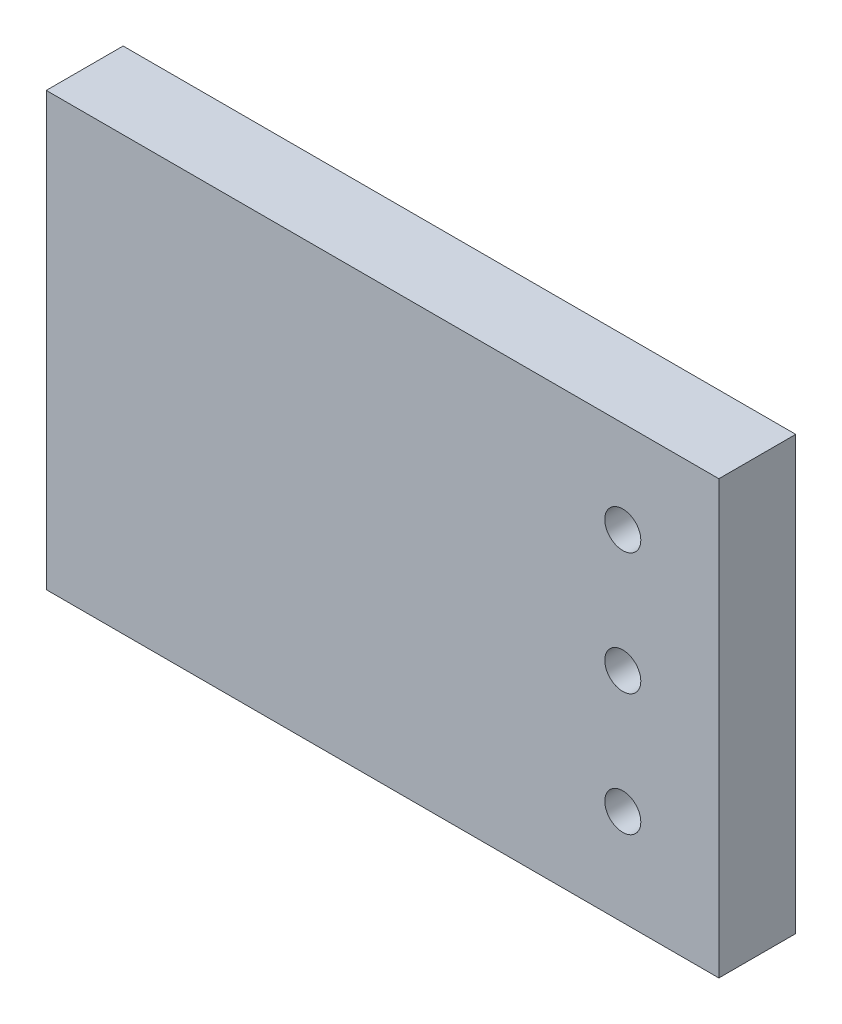
ISO-10303-21;
HEADER;
FILE_DESCRIPTION(('STEP AP214'),'2;1');
FILE_NAME('part.step','',(''),(''),'','','');
FILE_SCHEMA(('AUTOMOTIVE_DESIGN { 1 0 10303 214 1 1 1 1 }'));
ENDSEC;
DATA;
#1=APPLICATION_CONTEXT('core data for automotive mechanical design processes');
#2=APPLICATION_PROTOCOL_DEFINITION('international standard','automotive_design',2000,#1);
#3=PRODUCT_CONTEXT('',#1,'mechanical');
#4=PRODUCT('Part','Part','',(#3));
#5=PRODUCT_RELATED_PRODUCT_CATEGORY('part','',(#4));
#6=PRODUCT_DEFINITION_FORMATION('','',#4);
#7=PRODUCT_DEFINITION_CONTEXT('part definition',#1,'design');
#8=PRODUCT_DEFINITION('design','',#6,#7);
#9=PRODUCT_DEFINITION_SHAPE('','',#8);
#10=(LENGTH_UNIT() NAMED_UNIT(*) SI_UNIT(.MILLI.,.METRE.));
#11=(NAMED_UNIT(*) PLANE_ANGLE_UNIT() SI_UNIT($,.RADIAN.));
#12=(NAMED_UNIT(*) SI_UNIT($,.STERADIAN.) SOLID_ANGLE_UNIT());
#13=UNCERTAINTY_MEASURE_WITH_UNIT(LENGTH_MEASURE(1.E-05),#10,'distance_accuracy_value','');
#14=(GEOMETRIC_REPRESENTATION_CONTEXT(3) GLOBAL_UNCERTAINTY_ASSIGNED_CONTEXT((#13)) GLOBAL_UNIT_ASSIGNED_CONTEXT((#10,
#11,#12)) REPRESENTATION_CONTEXT('',''));
#15=CARTESIAN_POINT('',(0.,0.,0.));
#16=DIRECTION('',(0.,0.,1.));
#17=DIRECTION('',(1.,0.,0.));
#18=AXIS2_PLACEMENT_3D('',#15,#16,#17);
#19=CARTESIAN_POINT('',(0.,0.,1.6));
#20=DIRECTION('',(1.,0.,0.));
#21=DIRECTION('',(0.,1.,0.));
#22=AXIS2_PLACEMENT_3D('',#19,#20,#21);
#23=PLANE('',#22);
#24=DIRECTION('',(0.,-1.,0.));
#25=VECTOR('',#24,1.);
#26=CARTESIAN_POINT('',(0.,0.,0.));
#27=LINE('',#26,#25);
#28=CARTESIAN_POINT('',(0.,0.,0.));
#29=VERTEX_POINT('',#28);
#30=CARTESIAN_POINT('',(0.,-9.,0.));
#31=VERTEX_POINT('',#30);
#32=EDGE_CURVE('E97',#29,#31,#27,.T.);
#33=ORIENTED_EDGE('',*,*,#32,.T.);
#34=DIRECTION('',(0.,0.,-1.));
#35=VECTOR('',#34,1.);
#36=CARTESIAN_POINT('',(0.,-9.,1.6));
#37=LINE('',#36,#35);
#38=CARTESIAN_POINT('',(0.,-9.,1.6));
#39=VERTEX_POINT('',#38);
#40=EDGE_CURVE('E11',#39,#31,#37,.T.);
#41=ORIENTED_EDGE('',*,*,#40,.F.);
#42=DIRECTION('',(0.,-1.,0.));
#43=VECTOR('',#42,1.);
#44=CARTESIAN_POINT('',(0.,0.,1.6));
#45=LINE('',#44,#43);
#46=CARTESIAN_POINT('',(0.,0.,1.6));
#47=VERTEX_POINT('',#46);
#48=EDGE_CURVE('E85',#47,#39,#45,.T.);
#49=ORIENTED_EDGE('',*,*,#48,.F.);
#50=DIRECTION('',(0.,0.,-1.));
#51=VECTOR('',#50,1.);
#52=CARTESIAN_POINT('',(0.,0.,1.6));
#53=LINE('',#52,#51);
#54=EDGE_CURVE('E93',#47,#29,#53,.T.);
#55=ORIENTED_EDGE('',*,*,#54,.T.);
#56=EDGE_LOOP('',(#33,#41,#49,#55));
#57=FACE_BOUND('',#56,.T.);
#58=ADVANCED_FACE('F34',(#57),#23,.F.);
#59=CARTESIAN_POINT('',(0.,-9.,1.6));
#60=DIRECTION('',(0.,1.,0.));
#61=DIRECTION('',(0.,0.,1.));
#62=AXIS2_PLACEMENT_3D('',#59,#60,#61);
#63=PLANE('',#62);
#64=DIRECTION('',(1.,0.,0.));
#65=VECTOR('',#64,1.);
#66=CARTESIAN_POINT('',(0.,-9.,0.));
#67=LINE('',#66,#65);
#68=CARTESIAN_POINT('',(14.,-9.,0.));
#69=VERTEX_POINT('',#68);
#70=EDGE_CURVE('E89',#31,#69,#67,.T.);
#71=ORIENTED_EDGE('',*,*,#70,.T.);
#72=DIRECTION('',(0.,0.,-1.));
#73=VECTOR('',#72,1.);
#74=CARTESIAN_POINT('',(14.,-9.,1.6));
#75=LINE('',#74,#73);
#76=CARTESIAN_POINT('',(14.,-9.,1.6));
#77=VERTEX_POINT('',#76);
#78=EDGE_CURVE('E42',#77,#69,#75,.T.);
#79=ORIENTED_EDGE('',*,*,#78,.F.);
#80=DIRECTION('',(1.,0.,0.));
#81=VECTOR('',#80,1.);
#82=CARTESIAN_POINT('',(0.,-9.,1.6));
#83=LINE('',#82,#81);
#84=EDGE_CURVE('E80',#39,#77,#83,.T.);
#85=ORIENTED_EDGE('',*,*,#84,.F.);
#86=ORIENTED_EDGE('',*,*,#40,.T.);
#87=EDGE_LOOP('',(#71,#79,#85,#86));
#88=FACE_BOUND('',#87,.T.);
#89=ADVANCED_FACE('F88',(#88),#63,.F.);
#90=CARTESIAN_POINT('',(14.,0.,1.6));
#91=DIRECTION('',(-1.,0.,0.));
#92=DIRECTION('',(0.,0.,1.));
#93=AXIS2_PLACEMENT_3D('',#90,#91,#92);
#94=PLANE('',#93);
#95=DIRECTION('',(0.,1.,0.));
#96=VECTOR('',#95,1.);
#97=CARTESIAN_POINT('',(14.,0.,0.));
#98=LINE('',#97,#96);
#99=CARTESIAN_POINT('',(14.,0.,0.));
#100=VERTEX_POINT('',#99);
#101=EDGE_CURVE('E67',#69,#100,#98,.T.);
#102=ORIENTED_EDGE('',*,*,#101,.T.);
#103=DIRECTION('',(0.,0.,-1.));
#104=VECTOR('',#103,1.);
#105=CARTESIAN_POINT('',(14.,0.,1.6));
#106=LINE('',#105,#104);
#107=CARTESIAN_POINT('',(14.,0.,1.6));
#108=VERTEX_POINT('',#107);
#109=EDGE_CURVE('E90',#108,#100,#106,.T.);
#110=ORIENTED_EDGE('',*,*,#109,.F.);
#111=DIRECTION('',(0.,1.,0.));
#112=VECTOR('',#111,1.);
#113=CARTESIAN_POINT('',(14.,0.,1.6));
#114=LINE('',#113,#112);
#115=EDGE_CURVE('E83',#77,#108,#114,.T.);
#116=ORIENTED_EDGE('',*,*,#115,.F.);
#117=ORIENTED_EDGE('',*,*,#78,.T.);
#118=EDGE_LOOP('',(#102,#110,#116,#117));
#119=FACE_BOUND('',#118,.T.);
#120=ADVANCED_FACE('F91',(#119),#94,.F.);
#121=CARTESIAN_POINT('',(0.,0.,1.6));
#122=DIRECTION('',(0.,-1.,0.));
#123=DIRECTION('',(0.,0.,-1.));
#124=AXIS2_PLACEMENT_3D('',#121,#122,#123);
#125=PLANE('',#124);
#126=DIRECTION('',(-1.,0.,0.));
#127=VECTOR('',#126,1.);
#128=CARTESIAN_POINT('',(0.,0.,0.));
#129=LINE('',#128,#127);
#130=EDGE_CURVE('E73',#100,#29,#129,.T.);
#131=ORIENTED_EDGE('',*,*,#130,.T.);
#132=ORIENTED_EDGE('',*,*,#54,.F.);
#133=DIRECTION('',(-1.,0.,0.));
#134=VECTOR('',#133,1.);
#135=CARTESIAN_POINT('',(0.,0.,1.6));
#136=LINE('',#135,#134);
#137=EDGE_CURVE('E50',#108,#47,#136,.T.);
#138=ORIENTED_EDGE('',*,*,#137,.F.);
#139=ORIENTED_EDGE('',*,*,#109,.T.);
#140=EDGE_LOOP('',(#131,#132,#138,#139));
#141=FACE_BOUND('',#140,.T.);
#142=ADVANCED_FACE('F105',(#141),#125,.F.);
#143=CARTESIAN_POINT('',(0.,0.,1.6));
#144=DIRECTION('',(0.,0.,1.));
#145=DIRECTION('',(1.,0.,0.));
#146=AXIS2_PLACEMENT_3D('',#143,#144,#145);
#147=PLANE('',#146);
#148=CARTESIAN_POINT('',(12.,-7.,1.6));
#149=DIRECTION('',(0.,0.,1.));
#150=DIRECTION('',(1.,0.,0.));
#151=AXIS2_PLACEMENT_3D('',#148,#149,#150);
#152=CIRCLE('',#151,0.375000000000001);
#153=CARTESIAN_POINT('',(12.375,-7.,1.6));
#154=VERTEX_POINT('',#153);
#155=EDGE_CURVE('E123',#154,#154,#152,.T.);
#156=ORIENTED_EDGE('',*,*,#155,.F.);
#157=EDGE_LOOP('',(#156));
#158=FACE_BOUND('',#157,.T.);
#159=CARTESIAN_POINT('',(12.,-4.46,1.6));
#160=DIRECTION('',(0.,0.,1.));
#161=DIRECTION('',(1.,0.,0.));
#162=AXIS2_PLACEMENT_3D('',#159,#160,#161);
#163=CIRCLE('',#162,0.375000000000001);
#164=CARTESIAN_POINT('',(12.375,-4.46,1.6));
#165=VERTEX_POINT('',#164);
#166=EDGE_CURVE('E117',#165,#165,#163,.T.);
#167=ORIENTED_EDGE('',*,*,#166,.F.);
#168=EDGE_LOOP('',(#167));
#169=FACE_BOUND('',#168,.T.);
#170=CARTESIAN_POINT('',(12.,-1.92,1.6));
#171=DIRECTION('',(0.,0.,1.));
#172=DIRECTION('',(1.,0.,0.));
#173=AXIS2_PLACEMENT_3D('',#170,#171,#172);
#174=CIRCLE('',#173,0.375000000000001);
#175=CARTESIAN_POINT('',(12.375,-1.92,1.6));
#176=VERTEX_POINT('',#175);
#177=EDGE_CURVE('E111',#176,#176,#174,.T.);
#178=ORIENTED_EDGE('',*,*,#177,.F.);
#179=EDGE_LOOP('',(#178));
#180=FACE_BOUND('',#179,.T.);
#181=ORIENTED_EDGE('',*,*,#48,.T.);
#182=ORIENTED_EDGE('',*,*,#84,.T.);
#183=ORIENTED_EDGE('',*,*,#115,.T.);
#184=ORIENTED_EDGE('',*,*,#137,.T.);
#185=EDGE_LOOP('',(#181,#182,#183,#184));
#186=FACE_BOUND('',#185,.T.);
#187=ADVANCED_FACE('F81',(#158,#169,#180,#186),#147,.T.);
#188=CARTESIAN_POINT('',(0.,0.,0.));
#189=DIRECTION('',(0.,0.,1.));
#190=DIRECTION('',(1.,0.,0.));
#191=AXIS2_PLACEMENT_3D('',#188,#189,#190);
#192=PLANE('',#191);
#193=CARTESIAN_POINT('',(12.,-7.,0.));
#194=DIRECTION('',(0.,0.,1.));
#195=DIRECTION('',(1.,0.,0.));
#196=AXIS2_PLACEMENT_3D('',#193,#194,#195);
#197=CIRCLE('',#196,0.375000000000001);
#198=CARTESIAN_POINT('',(12.375,-7.,0.));
#199=VERTEX_POINT('',#198);
#200=EDGE_CURVE('E100',#199,#199,#197,.T.);
#201=ORIENTED_EDGE('',*,*,#200,.T.);
#202=EDGE_LOOP('',(#201));
#203=FACE_BOUND('',#202,.T.);
#204=CARTESIAN_POINT('',(12.,-4.46,0.));
#205=DIRECTION('',(0.,0.,1.));
#206=DIRECTION('',(1.,0.,0.));
#207=AXIS2_PLACEMENT_3D('',#204,#205,#206);
#208=CIRCLE('',#207,0.375000000000001);
#209=CARTESIAN_POINT('',(12.375,-4.46,0.));
#210=VERTEX_POINT('',#209);
#211=EDGE_CURVE('E120',#210,#210,#208,.T.);
#212=ORIENTED_EDGE('',*,*,#211,.T.);
#213=EDGE_LOOP('',(#212));
#214=FACE_BOUND('',#213,.T.);
#215=CARTESIAN_POINT('',(12.,-1.92,0.));
#216=DIRECTION('',(0.,0.,1.));
#217=DIRECTION('',(1.,0.,0.));
#218=AXIS2_PLACEMENT_3D('',#215,#216,#217);
#219=CIRCLE('',#218,0.375000000000001);
#220=CARTESIAN_POINT('',(12.375,-1.92,0.));
#221=VERTEX_POINT('',#220);
#222=EDGE_CURVE('E114',#221,#221,#219,.T.);
#223=ORIENTED_EDGE('',*,*,#222,.T.);
#224=EDGE_LOOP('',(#223));
#225=FACE_BOUND('',#224,.T.);
#226=ORIENTED_EDGE('',*,*,#32,.F.);
#227=ORIENTED_EDGE('',*,*,#130,.F.);
#228=ORIENTED_EDGE('',*,*,#101,.F.);
#229=ORIENTED_EDGE('',*,*,#70,.F.);
#230=EDGE_LOOP('',(#226,#227,#228,#229));
#231=FACE_BOUND('',#230,.T.);
#232=ADVANCED_FACE('F108',(#203,#214,#225,#231),#192,.F.);
#233=CARTESIAN_POINT('',(12.,-1.92,0.));
#234=DIRECTION('',(0.,0.,1.));
#235=DIRECTION('',(1.,0.,0.));
#236=AXIS2_PLACEMENT_3D('',#233,#234,#235);
#237=CYLINDRICAL_SURFACE('',#236,0.375000000000001);
#238=ORIENTED_EDGE('',*,*,#222,.F.);
#239=EDGE_LOOP('',(#238));
#240=FACE_BOUND('',#239,.T.);
#241=ORIENTED_EDGE('',*,*,#177,.T.);
#242=EDGE_LOOP('',(#241));
#243=FACE_BOUND('',#242,.T.);
#244=ADVANCED_FACE('F145',(#240,#243),#237,.F.);
#245=CARTESIAN_POINT('',(12.,-4.46,0.));
#246=DIRECTION('',(0.,0.,1.));
#247=DIRECTION('',(1.,0.,0.));
#248=AXIS2_PLACEMENT_3D('',#245,#246,#247);
#249=CYLINDRICAL_SURFACE('',#248,0.375000000000001);
#250=ORIENTED_EDGE('',*,*,#211,.F.);
#251=EDGE_LOOP('',(#250));
#252=FACE_BOUND('',#251,.T.);
#253=ORIENTED_EDGE('',*,*,#166,.T.);
#254=EDGE_LOOP('',(#253));
#255=FACE_BOUND('',#254,.T.);
#256=ADVANCED_FACE('F134',(#252,#255),#249,.F.);
#257=CARTESIAN_POINT('',(12.,-7.,0.));
#258=DIRECTION('',(0.,0.,1.));
#259=DIRECTION('',(1.,0.,0.));
#260=AXIS2_PLACEMENT_3D('',#257,#258,#259);
#261=CYLINDRICAL_SURFACE('',#260,0.375000000000001);
#262=ORIENTED_EDGE('',*,*,#200,.F.);
#263=EDGE_LOOP('',(#262));
#264=FACE_BOUND('',#263,.T.);
#265=ORIENTED_EDGE('',*,*,#155,.T.);
#266=EDGE_LOOP('',(#265));
#267=FACE_BOUND('',#266,.T.);
#268=ADVANCED_FACE('F131',(#264,#267),#261,.F.);
#269=CLOSED_SHELL('',(#58,#89,#120,#142,#187,#232,#244,#256,#268));
#270=MANIFOLD_SOLID_BREP('B2',#269);
#271=ADVANCED_BREP_SHAPE_REPRESENTATION('',(#18,#270),#14);
#272=SHAPE_DEFINITION_REPRESENTATION(#9,#271);
ENDSEC;
END-ISO-10303-21;
